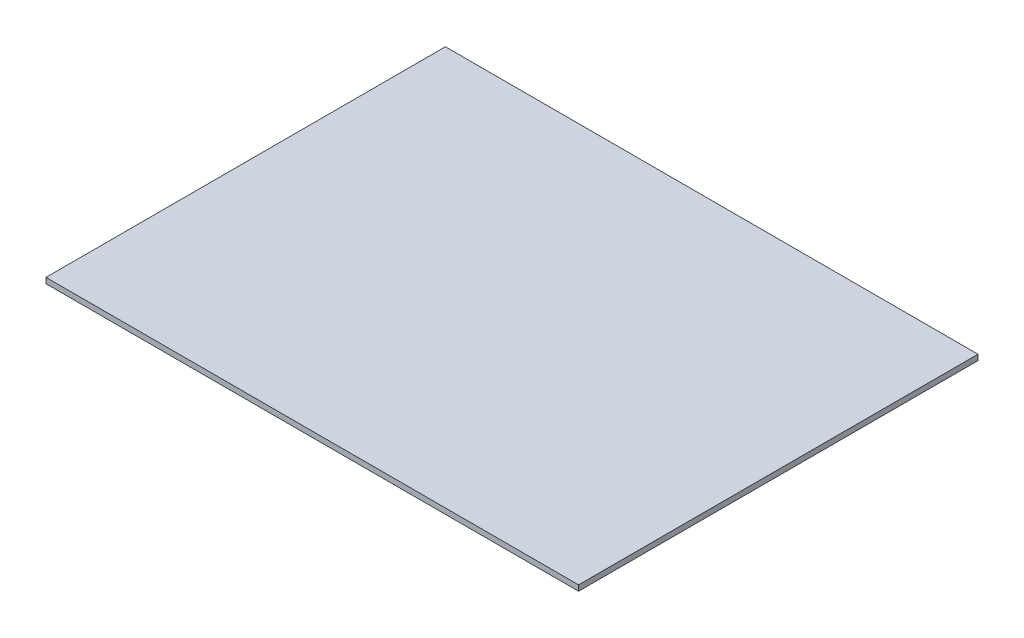
ISO-10303-21;
HEADER;
FILE_DESCRIPTION(('STEP AP214'),'2;1');
FILE_NAME('part.step','',(''),(''),'','','');
FILE_SCHEMA(('AUTOMOTIVE_DESIGN { 1 0 10303 214 1 1 1 1 }'));
ENDSEC;
DATA;
#1=APPLICATION_CONTEXT('core data for automotive mechanical design processes');
#2=APPLICATION_PROTOCOL_DEFINITION('international standard','automotive_design',2000,#1);
#3=PRODUCT_CONTEXT('',#1,'mechanical');
#4=PRODUCT('Part','Part','',(#3));
#5=PRODUCT_RELATED_PRODUCT_CATEGORY('part','',(#4));
#6=PRODUCT_DEFINITION_FORMATION('','',#4);
#7=PRODUCT_DEFINITION_CONTEXT('part definition',#1,'design');
#8=PRODUCT_DEFINITION('design','',#6,#7);
#9=PRODUCT_DEFINITION_SHAPE('','',#8);
#10=(LENGTH_UNIT() NAMED_UNIT(*) SI_UNIT(.MILLI.,.METRE.));
#11=(NAMED_UNIT(*) PLANE_ANGLE_UNIT() SI_UNIT($,.RADIAN.));
#12=(NAMED_UNIT(*) SI_UNIT($,.STERADIAN.) SOLID_ANGLE_UNIT());
#13=UNCERTAINTY_MEASURE_WITH_UNIT(LENGTH_MEASURE(1.E-05),#10,'distance_accuracy_value','');
#14=(GEOMETRIC_REPRESENTATION_CONTEXT(3) GLOBAL_UNCERTAINTY_ASSIGNED_CONTEXT((#13)) GLOBAL_UNIT_ASSIGNED_CONTEXT((#10,
#11,#12)) REPRESENTATION_CONTEXT('',''));
#15=CARTESIAN_POINT('',(0.,0.,0.));
#16=DIRECTION('',(0.,0.,1.));
#17=DIRECTION('',(1.,0.,0.));
#18=AXIS2_PLACEMENT_3D('',#15,#16,#17);
#19=CARTESIAN_POINT('',(304.8,6.35,228.6));
#20=DIRECTION('',(-1.,0.,0.));
#21=DIRECTION('',(0.,0.,1.));
#22=AXIS2_PLACEMENT_3D('',#19,#20,#21);
#23=PLANE('',#22);
#24=DIRECTION('',(0.,0.,-1.));
#25=VECTOR('',#24,1.);
#26=CARTESIAN_POINT('',(304.8,0.,228.6));
#27=LINE('',#26,#25);
#28=CARTESIAN_POINT('',(304.8,0.,228.6));
#29=VERTEX_POINT('',#28);
#30=CARTESIAN_POINT('',(304.8,0.,-228.6));
#31=VERTEX_POINT('',#30);
#32=EDGE_CURVE('E111',#29,#31,#27,.T.);
#33=ORIENTED_EDGE('',*,*,#32,.T.);
#34=DIRECTION('',(0.,-1.,0.));
#35=VECTOR('',#34,1.);
#36=CARTESIAN_POINT('',(304.8,6.35,-228.6));
#37=LINE('',#36,#35);
#38=CARTESIAN_POINT('',(304.8,6.35,-228.6));
#39=VERTEX_POINT('',#38);
#40=EDGE_CURVE('E11',#39,#31,#37,.T.);
#41=ORIENTED_EDGE('',*,*,#40,.F.);
#42=DIRECTION('',(0.,0.,-1.));
#43=VECTOR('',#42,1.);
#44=CARTESIAN_POINT('',(304.8,6.35,228.6));
#45=LINE('',#44,#43);
#46=CARTESIAN_POINT('',(304.8,6.35,228.6));
#47=VERTEX_POINT('',#46);
#48=EDGE_CURVE('E95',#47,#39,#45,.T.);
#49=ORIENTED_EDGE('',*,*,#48,.F.);
#50=DIRECTION('',(0.,-1.,0.));
#51=VECTOR('',#50,1.);
#52=CARTESIAN_POINT('',(304.8,6.35,228.6));
#53=LINE('',#52,#51);
#54=EDGE_CURVE('E107',#47,#29,#53,.T.);
#55=ORIENTED_EDGE('',*,*,#54,.T.);
#56=EDGE_LOOP('',(#33,#41,#49,#55));
#57=FACE_BOUND('',#56,.T.);
#58=ADVANCED_FACE('F43',(#57),#23,.F.);
#59=CARTESIAN_POINT('',(-304.8,6.35,-228.6));
#60=DIRECTION('',(0.,0.,1.));
#61=DIRECTION('',(1.,0.,0.));
#62=AXIS2_PLACEMENT_3D('',#59,#60,#61);
#63=PLANE('',#62);
#64=DIRECTION('',(-1.,0.,0.));
#65=VECTOR('',#64,1.);
#66=CARTESIAN_POINT('',(-304.8,0.,-228.6));
#67=LINE('',#66,#65);
#68=CARTESIAN_POINT('',(-304.8,0.,-228.6));
#69=VERTEX_POINT('',#68);
#70=EDGE_CURVE('E100',#31,#69,#67,.T.);
#71=ORIENTED_EDGE('',*,*,#70,.T.);
#72=DIRECTION('',(0.,-1.,0.));
#73=VECTOR('',#72,1.);
#74=CARTESIAN_POINT('',(-304.8,6.35,-228.6));
#75=LINE('',#74,#73);
#76=CARTESIAN_POINT('',(-304.8,6.35,-228.6));
#77=VERTEX_POINT('',#76);
#78=EDGE_CURVE('E52',#77,#69,#75,.T.);
#79=ORIENTED_EDGE('',*,*,#78,.F.);
#80=DIRECTION('',(-1.,0.,0.));
#81=VECTOR('',#80,1.);
#82=CARTESIAN_POINT('',(-304.8,6.35,-228.6));
#83=LINE('',#82,#81);
#84=EDGE_CURVE('E90',#39,#77,#83,.T.);
#85=ORIENTED_EDGE('',*,*,#84,.F.);
#86=ORIENTED_EDGE('',*,*,#40,.T.);
#87=EDGE_LOOP('',(#71,#79,#85,#86));
#88=FACE_BOUND('',#87,.T.);
#89=ADVANCED_FACE('F99',(#88),#63,.F.);
#90=CARTESIAN_POINT('',(-304.8,6.35,228.6));
#91=DIRECTION('',(1.,0.,0.));
#92=DIRECTION('',(0.,0.,-1.));
#93=AXIS2_PLACEMENT_3D('',#90,#91,#92);
#94=PLANE('',#93);
#95=DIRECTION('',(0.,0.,1.));
#96=VECTOR('',#95,1.);
#97=CARTESIAN_POINT('',(-304.8,0.,228.6));
#98=LINE('',#97,#96);
#99=CARTESIAN_POINT('',(-304.8,0.,228.6));
#100=VERTEX_POINT('',#99);
#101=EDGE_CURVE('E77',#69,#100,#98,.T.);
#102=ORIENTED_EDGE('',*,*,#101,.T.);
#103=DIRECTION('',(0.,-1.,0.));
#104=VECTOR('',#103,1.);
#105=CARTESIAN_POINT('',(-304.8,6.35,228.6));
#106=LINE('',#105,#104);
#107=CARTESIAN_POINT('',(-304.8,6.35,228.6));
#108=VERTEX_POINT('',#107);
#109=EDGE_CURVE('E102',#108,#100,#106,.T.);
#110=ORIENTED_EDGE('',*,*,#109,.F.);
#111=DIRECTION('',(0.,0.,1.));
#112=VECTOR('',#111,1.);
#113=CARTESIAN_POINT('',(-304.8,6.35,228.6));
#114=LINE('',#113,#112);
#115=EDGE_CURVE('E93',#77,#108,#114,.T.);
#116=ORIENTED_EDGE('',*,*,#115,.F.);
#117=ORIENTED_EDGE('',*,*,#78,.T.);
#118=EDGE_LOOP('',(#102,#110,#116,#117));
#119=FACE_BOUND('',#118,.T.);
#120=ADVANCED_FACE('F103',(#119),#94,.F.);
#121=CARTESIAN_POINT('',(-304.8,6.35,228.6));
#122=DIRECTION('',(0.,0.,-1.));
#123=DIRECTION('',(-1.,0.,0.));
#124=AXIS2_PLACEMENT_3D('',#121,#122,#123);
#125=PLANE('',#124);
#126=DIRECTION('',(1.,0.,0.));
#127=VECTOR('',#126,1.);
#128=CARTESIAN_POINT('',(-304.8,0.,228.6));
#129=LINE('',#128,#127);
#130=EDGE_CURVE('E83',#100,#29,#129,.T.);
#131=ORIENTED_EDGE('',*,*,#130,.T.);
#132=ORIENTED_EDGE('',*,*,#54,.F.);
#133=DIRECTION('',(1.,0.,0.));
#134=VECTOR('',#133,1.);
#135=CARTESIAN_POINT('',(-304.8,6.35,228.6));
#136=LINE('',#135,#134);
#137=EDGE_CURVE('E60',#108,#47,#136,.T.);
#138=ORIENTED_EDGE('',*,*,#137,.F.);
#139=ORIENTED_EDGE('',*,*,#109,.T.);
#140=EDGE_LOOP('',(#131,#132,#138,#139));
#141=FACE_BOUND('',#140,.T.);
#142=ADVANCED_FACE('F124',(#141),#125,.F.);
#143=CARTESIAN_POINT('',(0.,6.35,0.));
#144=DIRECTION('',(0.,-1.,0.));
#145=DIRECTION('',(0.,0.,-1.));
#146=AXIS2_PLACEMENT_3D('',#143,#144,#145);
#147=PLANE('',#146);
#148=ORIENTED_EDGE('',*,*,#48,.T.);
#149=ORIENTED_EDGE('',*,*,#84,.T.);
#150=ORIENTED_EDGE('',*,*,#115,.T.);
#151=ORIENTED_EDGE('',*,*,#137,.T.);
#152=EDGE_LOOP('',(#148,#149,#150,#151));
#153=FACE_BOUND('',#152,.T.);
#154=ADVANCED_FACE('F91',(#153),#147,.F.);
#155=CARTESIAN_POINT('',(0.,0.,0.));
#156=DIRECTION('',(0.,-1.,0.));
#157=DIRECTION('',(0.,0.,-1.));
#158=AXIS2_PLACEMENT_3D('',#155,#156,#157);
#159=PLANE('',#158);
#160=ORIENTED_EDGE('',*,*,#32,.F.);
#161=ORIENTED_EDGE('',*,*,#130,.F.);
#162=ORIENTED_EDGE('',*,*,#101,.F.);
#163=ORIENTED_EDGE('',*,*,#70,.F.);
#164=EDGE_LOOP('',(#160,#161,#162,#163));
#165=FACE_BOUND('',#164,.T.);
#166=ADVANCED_FACE('F127',(#165),#159,.T.);
#167=CLOSED_SHELL('',(#58,#89,#120,#142,#154,#166));
#168=MANIFOLD_SOLID_BREP('B2',#167);
#169=ADVANCED_BREP_SHAPE_REPRESENTATION('',(#18,#168),#14);
#170=SHAPE_DEFINITION_REPRESENTATION(#9,#169);
ENDSEC;
END-ISO-10303-21;
